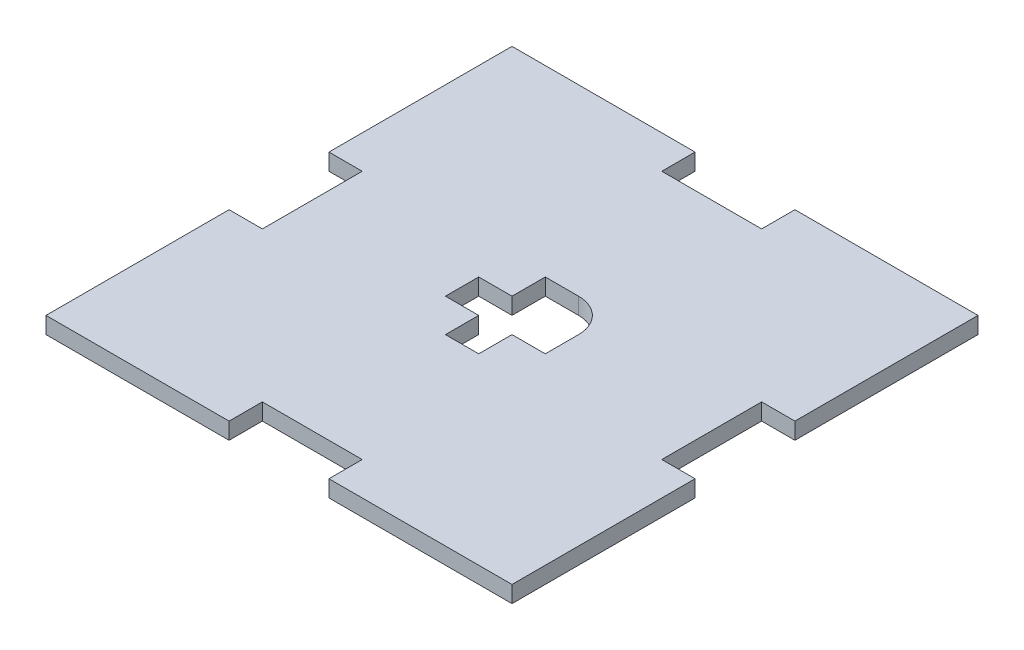
ISO-10303-21;
HEADER;
FILE_DESCRIPTION(('STEP AP214'),'2;1');
FILE_NAME('part.step','',(''),(''),'','','');
FILE_SCHEMA(('AUTOMOTIVE_DESIGN { 1 0 10303 214 1 1 1 1 }'));
ENDSEC;
DATA;
#1=APPLICATION_CONTEXT('core data for automotive mechanical design processes');
#2=APPLICATION_PROTOCOL_DEFINITION('international standard','automotive_design',2000,#1);
#3=PRODUCT_CONTEXT('',#1,'mechanical');
#4=PRODUCT('Part','Part','',(#3));
#5=PRODUCT_RELATED_PRODUCT_CATEGORY('part','',(#4));
#6=PRODUCT_DEFINITION_FORMATION('','',#4);
#7=PRODUCT_DEFINITION_CONTEXT('part definition',#1,'design');
#8=PRODUCT_DEFINITION('design','',#6,#7);
#9=PRODUCT_DEFINITION_SHAPE('','',#8);
#10=(LENGTH_UNIT() NAMED_UNIT(*) SI_UNIT(.MILLI.,.METRE.));
#11=(NAMED_UNIT(*) PLANE_ANGLE_UNIT() SI_UNIT($,.RADIAN.));
#12=(NAMED_UNIT(*) SI_UNIT($,.STERADIAN.) SOLID_ANGLE_UNIT());
#13=UNCERTAINTY_MEASURE_WITH_UNIT(LENGTH_MEASURE(1.E-05),#10,'distance_accuracy_value','');
#14=(GEOMETRIC_REPRESENTATION_CONTEXT(3) GLOBAL_UNCERTAINTY_ASSIGNED_CONTEXT((#13)) GLOBAL_UNIT_ASSIGNED_CONTEXT((#10,
#11,#12)) REPRESENTATION_CONTEXT('',''));
#15=CARTESIAN_POINT('',(0.,0.,0.));
#16=DIRECTION('',(0.,0.,1.));
#17=DIRECTION('',(1.,0.,0.));
#18=AXIS2_PLACEMENT_3D('',#15,#16,#17);
#19=CARTESIAN_POINT('',(0.,3.175,0.));
#20=DIRECTION('',(1.,0.,0.));
#21=DIRECTION('',(0.,0.,-1.));
#22=AXIS2_PLACEMENT_3D('',#19,#20,#21);
#23=PLANE('',#22);
#24=DIRECTION('',(0.,0.,1.));
#25=VECTOR('',#24,1.);
#26=CARTESIAN_POINT('',(0.,0.,0.));
#27=LINE('',#26,#25);
#28=CARTESIAN_POINT('',(0.,0.,-88.9));
#29=VERTEX_POINT('',#28);
#30=CARTESIAN_POINT('',(0.,0.,-53.9749999999999));
#31=VERTEX_POINT('',#30);
#32=EDGE_CURVE('E264',#29,#31,#27,.T.);
#33=ORIENTED_EDGE('',*,*,#32,.T.);
#34=DIRECTION('',(0.,1.,0.));
#35=VECTOR('',#34,1.);
#36=CARTESIAN_POINT('',(0.,0.,-53.9749999999999));
#37=LINE('',#36,#35);
#38=CARTESIAN_POINT('',(0.,3.175,-53.9749999999999));
#39=VERTEX_POINT('',#38);
#40=EDGE_CURVE('E800',#31,#39,#37,.T.);
#41=ORIENTED_EDGE('',*,*,#40,.T.);
#42=DIRECTION('',(0.,0.,1.));
#43=VECTOR('',#42,1.);
#44=CARTESIAN_POINT('',(0.,3.175,0.));
#45=LINE('',#44,#43);
#46=CARTESIAN_POINT('',(0.,3.175,-88.9));
#47=VERTEX_POINT('',#46);
#48=EDGE_CURVE('E361',#47,#39,#45,.T.);
#49=ORIENTED_EDGE('',*,*,#48,.F.);
#50=DIRECTION('',(0.,-1.,0.));
#51=VECTOR('',#50,1.);
#52=CARTESIAN_POINT('',(0.,3.175,-88.9));
#53=LINE('',#52,#51);
#54=EDGE_CURVE('E284',#47,#29,#53,.T.);
#55=ORIENTED_EDGE('',*,*,#54,.T.);
#56=EDGE_LOOP('',(#33,#41,#49,#55));
#57=FACE_BOUND('',#56,.T.);
#58=ADVANCED_FACE('F33',(#57),#23,.F.);
#59=CARTESIAN_POINT('',(0.,3.175,0.));
#60=DIRECTION('',(0.,0.,-1.));
#61=DIRECTION('',(-1.,0.,0.));
#62=AXIS2_PLACEMENT_3D('',#59,#60,#61);
#63=PLANE('',#62);
#64=DIRECTION('',(1.,0.,0.));
#65=VECTOR('',#64,1.);
#66=CARTESIAN_POINT('',(0.,0.,0.));
#67=LINE('',#66,#65);
#68=CARTESIAN_POINT('',(0.,0.,0.));
#69=VERTEX_POINT('',#68);
#70=CARTESIAN_POINT('',(34.9250000000001,0.,0.));
#71=VERTEX_POINT('',#70);
#72=EDGE_CURVE('E262',#69,#71,#67,.T.);
#73=ORIENTED_EDGE('',*,*,#72,.T.);
#74=DIRECTION('',(0.,1.,0.));
#75=VECTOR('',#74,1.);
#76=CARTESIAN_POINT('',(34.9250000000001,0.,0.));
#77=LINE('',#76,#75);
#78=CARTESIAN_POINT('',(34.9250000000001,3.175,0.));
#79=VERTEX_POINT('',#78);
#80=EDGE_CURVE('E774',#71,#79,#77,.T.);
#81=ORIENTED_EDGE('',*,*,#80,.T.);
#82=DIRECTION('',(1.,0.,0.));
#83=VECTOR('',#82,1.);
#84=CARTESIAN_POINT('',(0.,3.175,0.));
#85=LINE('',#84,#83);
#86=CARTESIAN_POINT('',(0.,3.175,0.));
#87=VERTEX_POINT('',#86);
#88=EDGE_CURVE('E365',#87,#79,#85,.T.);
#89=ORIENTED_EDGE('',*,*,#88,.F.);
#90=DIRECTION('',(0.,-1.,0.));
#91=VECTOR('',#90,1.);
#92=CARTESIAN_POINT('',(0.,3.175,0.));
#93=LINE('',#92,#91);
#94=EDGE_CURVE('E293',#87,#69,#93,.T.);
#95=ORIENTED_EDGE('',*,*,#94,.T.);
#96=EDGE_LOOP('',(#73,#81,#89,#95));
#97=FACE_BOUND('',#96,.T.);
#98=ADVANCED_FACE('F432',(#97),#63,.F.);
#99=CARTESIAN_POINT('',(88.9,3.175,0.));
#100=DIRECTION('',(-1.,0.,0.));
#101=DIRECTION('',(0.,0.,1.));
#102=AXIS2_PLACEMENT_3D('',#99,#100,#101);
#103=PLANE('',#102);
#104=DIRECTION('',(0.,0.,-1.));
#105=VECTOR('',#104,1.);
#106=CARTESIAN_POINT('',(88.9,0.,0.));
#107=LINE('',#106,#105);
#108=CARTESIAN_POINT('',(88.9,0.,0.));
#109=VERTEX_POINT('',#108);
#110=CARTESIAN_POINT('',(88.9,0.,-34.925));
#111=VERTEX_POINT('',#110);
#112=EDGE_CURVE('E277',#109,#111,#107,.T.);
#113=ORIENTED_EDGE('',*,*,#112,.T.);
#114=DIRECTION('',(0.,1.,0.));
#115=VECTOR('',#114,1.);
#116=CARTESIAN_POINT('',(88.9,0.,-34.925));
#117=LINE('',#116,#115);
#118=CARTESIAN_POINT('',(88.9,3.175,-34.925));
#119=VERTEX_POINT('',#118);
#120=EDGE_CURVE('E744',#111,#119,#117,.T.);
#121=ORIENTED_EDGE('',*,*,#120,.T.);
#122=DIRECTION('',(0.,0.,-1.));
#123=VECTOR('',#122,1.);
#124=CARTESIAN_POINT('',(88.9,3.175,0.));
#125=LINE('',#124,#123);
#126=CARTESIAN_POINT('',(88.9,3.175,0.));
#127=VERTEX_POINT('',#126);
#128=EDGE_CURVE('E368',#127,#119,#125,.T.);
#129=ORIENTED_EDGE('',*,*,#128,.F.);
#130=DIRECTION('',(0.,-1.,0.));
#131=VECTOR('',#130,1.);
#132=CARTESIAN_POINT('',(88.9,3.175,0.));
#133=LINE('',#132,#131);
#134=EDGE_CURVE('E290',#127,#109,#133,.T.);
#135=ORIENTED_EDGE('',*,*,#134,.T.);
#136=EDGE_LOOP('',(#113,#121,#129,#135));
#137=FACE_BOUND('',#136,.T.);
#138=ADVANCED_FACE('F437',(#137),#103,.F.);
#139=CARTESIAN_POINT('',(0.,3.175,-88.9));
#140=DIRECTION('',(0.,0.,1.));
#141=DIRECTION('',(1.,0.,0.));
#142=AXIS2_PLACEMENT_3D('',#139,#140,#141);
#143=PLANE('',#142);
#144=DIRECTION('',(-1.,0.,0.));
#145=VECTOR('',#144,1.);
#146=CARTESIAN_POINT('',(0.,3.175,-88.9));
#147=LINE('',#146,#145);
#148=CARTESIAN_POINT('',(34.925,3.175,-88.9));
#149=VERTEX_POINT('',#148);
#150=EDGE_CURVE('E370',#149,#47,#147,.T.);
#151=ORIENTED_EDGE('',*,*,#150,.F.);
#152=DIRECTION('',(0.,1.,0.));
#153=VECTOR('',#152,1.);
#154=CARTESIAN_POINT('',(34.925,0.,-88.9));
#155=LINE('',#154,#153);
#156=CARTESIAN_POINT('',(34.925,0.,-88.9));
#157=VERTEX_POINT('',#156);
#158=EDGE_CURVE('E314',#157,#149,#155,.T.);
#159=ORIENTED_EDGE('',*,*,#158,.F.);
#160=DIRECTION('',(-1.,0.,0.));
#161=VECTOR('',#160,1.);
#162=CARTESIAN_POINT('',(0.,0.,-88.9));
#163=LINE('',#162,#161);
#164=EDGE_CURVE('E280',#157,#29,#163,.T.);
#165=ORIENTED_EDGE('',*,*,#164,.T.);
#166=ORIENTED_EDGE('',*,*,#54,.F.);
#167=EDGE_LOOP('',(#151,#159,#165,#166));
#168=FACE_BOUND('',#167,.T.);
#169=ADVANCED_FACE('F442',(#168),#143,.F.);
#170=CARTESIAN_POINT('',(0.,3.175,-34.9249999999999));
#171=VERTEX_POINT('',#170);
#172=EDGE_CURVE('E255',#171,#87,#45,.T.);
#173=ORIENTED_EDGE('',*,*,#172,.F.);
#174=DIRECTION('',(0.,1.,0.));
#175=VECTOR('',#174,1.);
#176=CARTESIAN_POINT('',(0.,0.,-34.9249999999999));
#177=LINE('',#176,#175);
#178=CARTESIAN_POINT('',(0.,0.,-34.9249999999999));
#179=VERTEX_POINT('',#178);
#180=EDGE_CURVE('E240',#179,#171,#177,.T.);
#181=ORIENTED_EDGE('',*,*,#180,.F.);
#182=EDGE_CURVE('E253',#179,#69,#27,.T.);
#183=ORIENTED_EDGE('',*,*,#182,.T.);
#184=ORIENTED_EDGE('',*,*,#94,.F.);
#185=EDGE_LOOP('',(#173,#181,#183,#184));
#186=FACE_BOUND('',#185,.T.);
#187=ADVANCED_FACE('F251',(#186),#23,.F.);
#188=CARTESIAN_POINT('',(53.9750000000001,3.175,0.));
#189=VERTEX_POINT('',#188);
#190=EDGE_CURVE('E364',#189,#127,#85,.T.);
#191=ORIENTED_EDGE('',*,*,#190,.F.);
#192=DIRECTION('',(0.,1.,0.));
#193=VECTOR('',#192,1.);
#194=CARTESIAN_POINT('',(53.9750000000001,0.,0.));
#195=LINE('',#194,#193);
#196=CARTESIAN_POINT('',(53.9750000000001,0.,0.));
#197=VERTEX_POINT('',#196);
#198=EDGE_CURVE('E782',#197,#189,#195,.T.);
#199=ORIENTED_EDGE('',*,*,#198,.F.);
#200=EDGE_CURVE('E268',#197,#109,#67,.T.);
#201=ORIENTED_EDGE('',*,*,#200,.T.);
#202=ORIENTED_EDGE('',*,*,#134,.F.);
#203=EDGE_LOOP('',(#191,#199,#201,#202));
#204=FACE_BOUND('',#203,.T.);
#205=ADVANCED_FACE('F440',(#204),#63,.F.);
#206=CARTESIAN_POINT('',(88.9,3.175,-53.975));
#207=VERTEX_POINT('',#206);
#208=CARTESIAN_POINT('',(88.9,3.175,-88.9));
#209=VERTEX_POINT('',#208);
#210=EDGE_CURVE('E367',#207,#209,#125,.T.);
#211=ORIENTED_EDGE('',*,*,#210,.F.);
#212=DIRECTION('',(0.,1.,0.));
#213=VECTOR('',#212,1.);
#214=CARTESIAN_POINT('',(88.9,0.,-53.975));
#215=LINE('',#214,#213);
#216=CARTESIAN_POINT('',(88.9,0.,-53.975));
#217=VERTEX_POINT('',#216);
#218=EDGE_CURVE('E758',#217,#207,#215,.T.);
#219=ORIENTED_EDGE('',*,*,#218,.F.);
#220=CARTESIAN_POINT('',(88.9,0.,-88.9));
#221=VERTEX_POINT('',#220);
#222=EDGE_CURVE('E276',#217,#221,#107,.T.);
#223=ORIENTED_EDGE('',*,*,#222,.T.);
#224=DIRECTION('',(0.,-1.,0.));
#225=VECTOR('',#224,1.);
#226=CARTESIAN_POINT('',(88.9,3.175,-88.9));
#227=LINE('',#226,#225);
#228=EDGE_CURVE('E287',#209,#221,#227,.T.);
#229=ORIENTED_EDGE('',*,*,#228,.F.);
#230=EDGE_LOOP('',(#211,#219,#223,#229));
#231=FACE_BOUND('',#230,.T.);
#232=ADVANCED_FACE('F384',(#231),#103,.F.);
#233=CARTESIAN_POINT('',(53.975,0.,-88.9));
#234=VERTEX_POINT('',#233);
#235=EDGE_CURVE('E281',#221,#234,#163,.T.);
#236=ORIENTED_EDGE('',*,*,#235,.T.);
#237=DIRECTION('',(0.,1.,0.));
#238=VECTOR('',#237,1.);
#239=CARTESIAN_POINT('',(53.975,0.,-88.9));
#240=LINE('',#239,#238);
#241=CARTESIAN_POINT('',(53.975,3.175,-88.9));
#242=VERTEX_POINT('',#241);
#243=EDGE_CURVE('E318',#234,#242,#240,.T.);
#244=ORIENTED_EDGE('',*,*,#243,.T.);
#245=EDGE_CURVE('E273',#209,#242,#147,.T.);
#246=ORIENTED_EDGE('',*,*,#245,.F.);
#247=ORIENTED_EDGE('',*,*,#228,.T.);
#248=EDGE_LOOP('',(#236,#244,#246,#247));
#249=FACE_BOUND('',#248,.T.);
#250=ADVANCED_FACE('F389',(#249),#143,.F.);
#251=CARTESIAN_POINT('',(0.,3.175,0.));
#252=DIRECTION('',(0.,-1.,0.));
#253=DIRECTION('',(0.,0.,-1.));
#254=AXIS2_PLACEMENT_3D('',#251,#252,#253);
#255=PLANE('',#254);
#256=DIRECTION('',(-1.,0.,0.));
#257=VECTOR('',#256,1.);
#258=CARTESIAN_POINT('',(47.625,3.175,-53.975));
#259=LINE('',#258,#257);
#260=CARTESIAN_POINT('',(47.625,3.175,-53.975));
#261=VERTEX_POINT('',#260);
#262=CARTESIAN_POINT('',(41.275,3.175,-53.975));
#263=VERTEX_POINT('',#262);
#264=EDGE_CURVE('E303',#261,#263,#259,.T.);
#265=ORIENTED_EDGE('',*,*,#264,.F.);
#266=CARTESIAN_POINT('',(47.625,3.175,-47.625));
#267=DIRECTION('',(0.,-1.,0.));
#268=DIRECTION('',(0.,0.,-1.));
#269=AXIS2_PLACEMENT_3D('',#266,#267,#268);
#270=CIRCLE('',#269,6.35);
#271=CARTESIAN_POINT('',(53.975,3.175,-47.625));
#272=VERTEX_POINT('',#271);
#273=EDGE_CURVE('E41',#261,#272,#270,.T.);
#274=ORIENTED_EDGE('',*,*,#273,.T.);
#275=DIRECTION('',(0.,0.,-1.));
#276=VECTOR('',#275,1.);
#277=CARTESIAN_POINT('',(53.975,3.175,-41.275));
#278=LINE('',#277,#276);
#279=CARTESIAN_POINT('',(53.975,3.175,-41.275));
#280=VERTEX_POINT('',#279);
#281=EDGE_CURVE('E344',#280,#272,#278,.T.);
#282=ORIENTED_EDGE('',*,*,#281,.F.);
#283=DIRECTION('',(1.,0.,0.));
#284=VECTOR('',#283,1.);
#285=CARTESIAN_POINT('',(47.625,3.175,-41.275));
#286=LINE('',#285,#284);
#287=CARTESIAN_POINT('',(47.625,3.175,-41.275));
#288=VERTEX_POINT('',#287);
#289=EDGE_CURVE('E341',#288,#280,#286,.T.);
#290=ORIENTED_EDGE('',*,*,#289,.F.);
#291=DIRECTION('',(0.,0.,-1.));
#292=VECTOR('',#291,1.);
#293=CARTESIAN_POINT('',(47.625,3.175,-34.925));
#294=LINE('',#293,#292);
#295=CARTESIAN_POINT('',(47.625,3.175,-34.925));
#296=VERTEX_POINT('',#295);
#297=EDGE_CURVE('E338',#296,#288,#294,.T.);
#298=ORIENTED_EDGE('',*,*,#297,.F.);
#299=DIRECTION('',(1.,0.,0.));
#300=VECTOR('',#299,1.);
#301=CARTESIAN_POINT('',(47.625,3.175,-34.925));
#302=LINE('',#301,#300);
#303=CARTESIAN_POINT('',(41.275,3.175,-34.925));
#304=VERTEX_POINT('',#303);
#305=EDGE_CURVE('E335',#304,#296,#302,.T.);
#306=ORIENTED_EDGE('',*,*,#305,.F.);
#307=DIRECTION('',(0.,0.,1.));
#308=VECTOR('',#307,1.);
#309=CARTESIAN_POINT('',(41.275,3.175,-34.925));
#310=LINE('',#309,#308);
#311=CARTESIAN_POINT('',(41.275,3.175,-41.275));
#312=VERTEX_POINT('',#311);
#313=EDGE_CURVE('E332',#312,#304,#310,.T.);
#314=ORIENTED_EDGE('',*,*,#313,.F.);
#315=DIRECTION('',(1.,0.,0.));
#316=VECTOR('',#315,1.);
#317=CARTESIAN_POINT('',(34.925,3.175,-41.275));
#318=LINE('',#317,#316);
#319=CARTESIAN_POINT('',(34.925,3.175,-41.275));
#320=VERTEX_POINT('',#319);
#321=EDGE_CURVE('E329',#320,#312,#318,.T.);
#322=ORIENTED_EDGE('',*,*,#321,.F.);
#323=DIRECTION('',(0.,0.,1.));
#324=VECTOR('',#323,1.);
#325=CARTESIAN_POINT('',(34.925,3.175,-41.275));
#326=LINE('',#325,#324);
#327=CARTESIAN_POINT('',(34.925,3.175,-47.625));
#328=VERTEX_POINT('',#327);
#329=EDGE_CURVE('E326',#328,#320,#326,.T.);
#330=ORIENTED_EDGE('',*,*,#329,.F.);
#331=DIRECTION('',(-1.,0.,0.));
#332=VECTOR('',#331,1.);
#333=CARTESIAN_POINT('',(34.925,3.175,-47.625));
#334=LINE('',#333,#332);
#335=CARTESIAN_POINT('',(41.275,3.175,-47.625));
#336=VERTEX_POINT('',#335);
#337=EDGE_CURVE('E316',#336,#328,#334,.T.);
#338=ORIENTED_EDGE('',*,*,#337,.F.);
#339=DIRECTION('',(0.,0.,1.));
#340=VECTOR('',#339,1.);
#341=CARTESIAN_POINT('',(41.275,3.175,-47.625));
#342=LINE('',#341,#340);
#343=EDGE_CURVE('E313',#263,#336,#342,.T.);
#344=ORIENTED_EDGE('',*,*,#343,.F.);
#345=EDGE_LOOP('',(#265,#274,#282,#290,#298,#306,#314,#322,#330,#338,#344));
#346=FACE_BOUND('',#345,.T.);
#347=ORIENTED_EDGE('',*,*,#48,.T.);
#348=DIRECTION('',(-1.,0.,0.));
#349=VECTOR('',#348,1.);
#350=CARTESIAN_POINT('',(0.,3.175,-53.9749999999999));
#351=LINE('',#350,#349);
#352=CARTESIAN_POINT('',(6.35000000000001,3.175,-53.9749999999999));
#353=VERTEX_POINT('',#352);
#354=EDGE_CURVE('E247',#353,#39,#351,.T.);
#355=ORIENTED_EDGE('',*,*,#354,.F.);
#356=DIRECTION('',(0.,0.,-1.));
#357=VECTOR('',#356,1.);
#358=CARTESIAN_POINT('',(6.35000000000004,3.175,-34.9249999999999));
#359=LINE('',#358,#357);
#360=CARTESIAN_POINT('',(6.35000000000004,3.175,-34.9249999999999));
#361=VERTEX_POINT('',#360);
#362=EDGE_CURVE('E813',#361,#353,#359,.T.);
#363=ORIENTED_EDGE('',*,*,#362,.F.);
#364=DIRECTION('',(1.,0.,0.));
#365=VECTOR('',#364,1.);
#366=CARTESIAN_POINT('',(0.,3.175,-34.9249999999999));
#367=LINE('',#366,#365);
#368=EDGE_CURVE('E816',#171,#361,#367,.T.);
#369=ORIENTED_EDGE('',*,*,#368,.F.);
#370=ORIENTED_EDGE('',*,*,#172,.T.);
#371=ORIENTED_EDGE('',*,*,#88,.T.);
#372=DIRECTION('',(0.,0.,1.));
#373=VECTOR('',#372,1.);
#374=CARTESIAN_POINT('',(34.9250000000001,3.175,0.));
#375=LINE('',#374,#373);
#376=CARTESIAN_POINT('',(34.9250000000001,3.175,-6.34999999999999));
#377=VERTEX_POINT('',#376);
#378=EDGE_CURVE('E791',#377,#79,#375,.T.);
#379=ORIENTED_EDGE('',*,*,#378,.F.);
#380=DIRECTION('',(-1.,0.,0.));
#381=VECTOR('',#380,1.);
#382=CARTESIAN_POINT('',(53.9750000000001,3.175,-6.35000000000001));
#383=LINE('',#382,#381);
#384=CARTESIAN_POINT('',(53.9750000000001,3.175,-6.35000000000001));
#385=VERTEX_POINT('',#384);
#386=EDGE_CURVE('E794',#385,#377,#383,.T.);
#387=ORIENTED_EDGE('',*,*,#386,.F.);
#388=DIRECTION('',(0.,0.,-1.));
#389=VECTOR('',#388,1.);
#390=CARTESIAN_POINT('',(53.9750000000001,3.175,0.));
#391=LINE('',#390,#389);
#392=EDGE_CURVE('E797',#189,#385,#391,.T.);
#393=ORIENTED_EDGE('',*,*,#392,.F.);
#394=ORIENTED_EDGE('',*,*,#190,.T.);
#395=ORIENTED_EDGE('',*,*,#128,.T.);
#396=DIRECTION('',(1.,0.,0.));
#397=VECTOR('',#396,1.);
#398=CARTESIAN_POINT('',(88.9,3.175,-34.925));
#399=LINE('',#398,#397);
#400=CARTESIAN_POINT('',(82.55,3.175,-34.925));
#401=VERTEX_POINT('',#400);
#402=EDGE_CURVE('E767',#401,#119,#399,.T.);
#403=ORIENTED_EDGE('',*,*,#402,.F.);
#404=DIRECTION('',(0.,0.,1.));
#405=VECTOR('',#404,1.);
#406=CARTESIAN_POINT('',(82.55,3.175,-53.975));
#407=LINE('',#406,#405);
#408=CARTESIAN_POINT('',(82.55,3.175,-53.975));
#409=VERTEX_POINT('',#408);
#410=EDGE_CURVE('E770',#409,#401,#407,.T.);
#411=ORIENTED_EDGE('',*,*,#410,.F.);
#412=DIRECTION('',(-1.,0.,0.));
#413=VECTOR('',#412,1.);
#414=CARTESIAN_POINT('',(88.9,3.175,-53.975));
#415=LINE('',#414,#413);
#416=EDGE_CURVE('E381',#207,#409,#415,.T.);
#417=ORIENTED_EDGE('',*,*,#416,.F.);
#418=ORIENTED_EDGE('',*,*,#210,.T.);
#419=ORIENTED_EDGE('',*,*,#245,.T.);
#420=DIRECTION('',(0.,0.,-1.));
#421=VECTOR('',#420,1.);
#422=CARTESIAN_POINT('',(53.975,3.175,-88.9));
#423=LINE('',#422,#421);
#424=CARTESIAN_POINT('',(53.975,3.175,-82.55));
#425=VERTEX_POINT('',#424);
#426=EDGE_CURVE('E747',#425,#242,#423,.T.);
#427=ORIENTED_EDGE('',*,*,#426,.F.);
#428=DIRECTION('',(1.,0.,0.));
#429=VECTOR('',#428,1.);
#430=CARTESIAN_POINT('',(34.925,3.175,-82.55));
#431=LINE('',#430,#429);
#432=CARTESIAN_POINT('',(34.925,3.175,-82.55));
#433=VERTEX_POINT('',#432);
#434=EDGE_CURVE('E743',#433,#425,#431,.T.);
#435=ORIENTED_EDGE('',*,*,#434,.F.);
#436=DIRECTION('',(0.,0.,1.));
#437=VECTOR('',#436,1.);
#438=CARTESIAN_POINT('',(34.925,3.175,-88.9));
#439=LINE('',#438,#437);
#440=EDGE_CURVE('E739',#149,#433,#439,.T.);
#441=ORIENTED_EDGE('',*,*,#440,.F.);
#442=ORIENTED_EDGE('',*,*,#150,.T.);
#443=EDGE_LOOP('',(#347,#355,#363,#369,#370,#371,#379,#387,#393,#394,#395,#403,#411,#417,#418,
#419,#427,#435,#441,#442));
#444=FACE_BOUND('',#443,.T.);
#445=ADVANCED_FACE('F309',(#346,#444),#255,.F.);
#446=CARTESIAN_POINT('',(0.,0.,0.));
#447=DIRECTION('',(0.,-1.,0.));
#448=DIRECTION('',(0.,0.,-1.));
#449=AXIS2_PLACEMENT_3D('',#446,#447,#448);
#450=PLANE('',#449);
#451=DIRECTION('',(0.,0.,-1.));
#452=VECTOR('',#451,1.);
#453=CARTESIAN_POINT('',(53.975,0.,-41.275));
#454=LINE('',#453,#452);
#455=CARTESIAN_POINT('',(53.975,0.,-41.275));
#456=VERTEX_POINT('',#455);
#457=CARTESIAN_POINT('',(53.975,0.,-47.625));
#458=VERTEX_POINT('',#457);
#459=EDGE_CURVE('E321',#456,#458,#454,.T.);
#460=ORIENTED_EDGE('',*,*,#459,.T.);
#461=CARTESIAN_POINT('',(47.625,0.,-47.625));
#462=DIRECTION('',(0.,-1.,0.));
#463=DIRECTION('',(0.,0.,-1.));
#464=AXIS2_PLACEMENT_3D('',#461,#462,#463);
#465=CIRCLE('',#464,6.35);
#466=CARTESIAN_POINT('',(47.625,0.,-53.975));
#467=VERTEX_POINT('',#466);
#468=EDGE_CURVE('E11',#458,#467,#465,.F.);
#469=ORIENTED_EDGE('',*,*,#468,.T.);
#470=DIRECTION('',(-1.,0.,0.));
#471=VECTOR('',#470,1.);
#472=CARTESIAN_POINT('',(47.625,0.,-53.975));
#473=LINE('',#472,#471);
#474=CARTESIAN_POINT('',(41.275,0.,-53.975));
#475=VERTEX_POINT('',#474);
#476=EDGE_CURVE('E305',#467,#475,#473,.T.);
#477=ORIENTED_EDGE('',*,*,#476,.T.);
#478=DIRECTION('',(0.,0.,1.));
#479=VECTOR('',#478,1.);
#480=CARTESIAN_POINT('',(41.275,0.,-47.625));
#481=LINE('',#480,#479);
#482=CARTESIAN_POINT('',(41.275,0.,-47.625));
#483=VERTEX_POINT('',#482);
#484=EDGE_CURVE('E401',#475,#483,#481,.T.);
#485=ORIENTED_EDGE('',*,*,#484,.T.);
#486=DIRECTION('',(-1.,0.,0.));
#487=VECTOR('',#486,1.);
#488=CARTESIAN_POINT('',(34.925,0.,-47.625));
#489=LINE('',#488,#487);
#490=CARTESIAN_POINT('',(34.925,0.,-47.625));
#491=VERTEX_POINT('',#490);
#492=EDGE_CURVE('E404',#483,#491,#489,.T.);
#493=ORIENTED_EDGE('',*,*,#492,.T.);
#494=DIRECTION('',(0.,0.,1.));
#495=VECTOR('',#494,1.);
#496=CARTESIAN_POINT('',(34.925,0.,-41.275));
#497=LINE('',#496,#495);
#498=CARTESIAN_POINT('',(34.925,0.,-41.275));
#499=VERTEX_POINT('',#498);
#500=EDGE_CURVE('E407',#491,#499,#497,.T.);
#501=ORIENTED_EDGE('',*,*,#500,.T.);
#502=DIRECTION('',(1.,0.,0.));
#503=VECTOR('',#502,1.);
#504=CARTESIAN_POINT('',(34.925,0.,-41.275));
#505=LINE('',#504,#503);
#506=CARTESIAN_POINT('',(41.275,0.,-41.275));
#507=VERTEX_POINT('',#506);
#508=EDGE_CURVE('E410',#499,#507,#505,.T.);
#509=ORIENTED_EDGE('',*,*,#508,.T.);
#510=DIRECTION('',(0.,0.,1.));
#511=VECTOR('',#510,1.);
#512=CARTESIAN_POINT('',(41.275,0.,-34.925));
#513=LINE('',#512,#511);
#514=CARTESIAN_POINT('',(41.275,0.,-34.925));
#515=VERTEX_POINT('',#514);
#516=EDGE_CURVE('E413',#507,#515,#513,.T.);
#517=ORIENTED_EDGE('',*,*,#516,.T.);
#518=DIRECTION('',(1.,0.,0.));
#519=VECTOR('',#518,1.);
#520=CARTESIAN_POINT('',(47.625,0.,-34.925));
#521=LINE('',#520,#519);
#522=CARTESIAN_POINT('',(47.625,0.,-34.925));
#523=VERTEX_POINT('',#522);
#524=EDGE_CURVE('E416',#515,#523,#521,.T.);
#525=ORIENTED_EDGE('',*,*,#524,.T.);
#526=DIRECTION('',(0.,0.,-1.));
#527=VECTOR('',#526,1.);
#528=CARTESIAN_POINT('',(47.625,0.,-34.925));
#529=LINE('',#528,#527);
#530=CARTESIAN_POINT('',(47.625,0.,-41.275));
#531=VERTEX_POINT('',#530);
#532=EDGE_CURVE('E419',#523,#531,#529,.T.);
#533=ORIENTED_EDGE('',*,*,#532,.T.);
#534=DIRECTION('',(1.,0.,0.));
#535=VECTOR('',#534,1.);
#536=CARTESIAN_POINT('',(47.625,0.,-41.275));
#537=LINE('',#536,#535);
#538=EDGE_CURVE('E421',#531,#456,#537,.T.);
#539=ORIENTED_EDGE('',*,*,#538,.T.);
#540=EDGE_LOOP('',(#460,#469,#477,#485,#493,#501,#509,#517,#525,#533,#539));
#541=FACE_BOUND('',#540,.T.);
#542=DIRECTION('',(-1.,0.,0.));
#543=VECTOR('',#542,1.);
#544=CARTESIAN_POINT('',(0.,0.,-53.9749999999999));
#545=LINE('',#544,#543);
#546=CARTESIAN_POINT('',(6.35000000000001,0.,-53.9749999999999));
#547=VERTEX_POINT('',#546);
#548=EDGE_CURVE('E256',#547,#31,#545,.T.);
#549=ORIENTED_EDGE('',*,*,#548,.T.);
#550=ORIENTED_EDGE('',*,*,#32,.F.);
#551=ORIENTED_EDGE('',*,*,#164,.F.);
#552=DIRECTION('',(0.,0.,1.));
#553=VECTOR('',#552,1.);
#554=CARTESIAN_POINT('',(34.925,0.,-88.9));
#555=LINE('',#554,#553);
#556=CARTESIAN_POINT('',(34.925,0.,-82.55));
#557=VERTEX_POINT('',#556);
#558=EDGE_CURVE('E750',#157,#557,#555,.T.);
#559=ORIENTED_EDGE('',*,*,#558,.T.);
#560=DIRECTION('',(1.,0.,0.));
#561=VECTOR('',#560,1.);
#562=CARTESIAN_POINT('',(34.925,0.,-82.55));
#563=LINE('',#562,#561);
#564=CARTESIAN_POINT('',(53.975,0.,-82.55));
#565=VERTEX_POINT('',#564);
#566=EDGE_CURVE('E753',#557,#565,#563,.T.);
#567=ORIENTED_EDGE('',*,*,#566,.T.);
#568=DIRECTION('',(0.,0.,-1.));
#569=VECTOR('',#568,1.);
#570=CARTESIAN_POINT('',(53.975,0.,-88.9));
#571=LINE('',#570,#569);
#572=EDGE_CURVE('E399',#565,#234,#571,.T.);
#573=ORIENTED_EDGE('',*,*,#572,.T.);
#574=ORIENTED_EDGE('',*,*,#235,.F.);
#575=ORIENTED_EDGE('',*,*,#222,.F.);
#576=DIRECTION('',(-1.,0.,0.));
#577=VECTOR('',#576,1.);
#578=CARTESIAN_POINT('',(88.9,0.,-53.975));
#579=LINE('',#578,#577);
#580=CARTESIAN_POINT('',(82.55,0.,-53.975));
#581=VERTEX_POINT('',#580);
#582=EDGE_CURVE('E769',#217,#581,#579,.T.);
#583=ORIENTED_EDGE('',*,*,#582,.T.);
#584=DIRECTION('',(0.,0.,1.));
#585=VECTOR('',#584,1.);
#586=CARTESIAN_POINT('',(82.55,0.,-53.975));
#587=LINE('',#586,#585);
#588=CARTESIAN_POINT('',(82.55,0.,-34.925));
#589=VERTEX_POINT('',#588);
#590=EDGE_CURVE('E777',#581,#589,#587,.T.);
#591=ORIENTED_EDGE('',*,*,#590,.T.);
#592=DIRECTION('',(1.,0.,0.));
#593=VECTOR('',#592,1.);
#594=CARTESIAN_POINT('',(88.9,0.,-34.925));
#595=LINE('',#594,#593);
#596=EDGE_CURVE('E761',#589,#111,#595,.T.);
#597=ORIENTED_EDGE('',*,*,#596,.T.);
#598=ORIENTED_EDGE('',*,*,#112,.F.);
#599=ORIENTED_EDGE('',*,*,#200,.F.);
#600=DIRECTION('',(0.,0.,-1.));
#601=VECTOR('',#600,1.);
#602=CARTESIAN_POINT('',(53.9750000000001,0.,0.));
#603=LINE('',#602,#601);
#604=CARTESIAN_POINT('',(53.9750000000001,0.,-6.35000000000001));
#605=VERTEX_POINT('',#604);
#606=EDGE_CURVE('E793',#197,#605,#603,.T.);
#607=ORIENTED_EDGE('',*,*,#606,.T.);
#608=DIRECTION('',(-1.,0.,0.));
#609=VECTOR('',#608,1.);
#610=CARTESIAN_POINT('',(53.9750000000001,0.,-6.35000000000001));
#611=LINE('',#610,#609);
#612=CARTESIAN_POINT('',(34.9250000000001,0.,-6.34999999999999));
#613=VERTEX_POINT('',#612);
#614=EDGE_CURVE('E802',#605,#613,#611,.T.);
#615=ORIENTED_EDGE('',*,*,#614,.T.);
#616=DIRECTION('',(0.,0.,1.));
#617=VECTOR('',#616,1.);
#618=CARTESIAN_POINT('',(34.9250000000001,0.,0.));
#619=LINE('',#618,#617);
#620=EDGE_CURVE('E785',#613,#71,#619,.T.);
#621=ORIENTED_EDGE('',*,*,#620,.T.);
#622=ORIENTED_EDGE('',*,*,#72,.F.);
#623=ORIENTED_EDGE('',*,*,#182,.F.);
#624=DIRECTION('',(1.,0.,0.));
#625=VECTOR('',#624,1.);
#626=CARTESIAN_POINT('',(0.,0.,-34.9249999999999));
#627=LINE('',#626,#625);
#628=CARTESIAN_POINT('',(6.35000000000004,0.,-34.9249999999999));
#629=VERTEX_POINT('',#628);
#630=EDGE_CURVE('E236',#179,#629,#627,.T.);
#631=ORIENTED_EDGE('',*,*,#630,.T.);
#632=DIRECTION('',(0.,0.,-1.));
#633=VECTOR('',#632,1.);
#634=CARTESIAN_POINT('',(6.35000000000004,0.,-34.9249999999999));
#635=LINE('',#634,#633);
#636=EDGE_CURVE('E246',#629,#547,#635,.T.);
#637=ORIENTED_EDGE('',*,*,#636,.T.);
#638=EDGE_LOOP('',(#549,#550,#551,#559,#567,#573,#574,#575,#583,#591,#597,#598,#599,#607,#615,
#621,#622,#623,#631,#637));
#639=FACE_BOUND('',#638,.T.);
#640=ADVANCED_FACE('F259',(#541,#639),#450,.T.);
#641=CARTESIAN_POINT('',(53.975,0.,-41.275));
#642=DIRECTION('',(1.,0.,0.));
#643=DIRECTION('',(0.,0.,-1.));
#644=AXIS2_PLACEMENT_3D('',#641,#642,#643);
#645=PLANE('',#644);
#646=ORIENTED_EDGE('',*,*,#281,.T.);
#647=DIRECTION('',(0.,1.,0.));
#648=VECTOR('',#647,1.);
#649=CARTESIAN_POINT('',(53.975,0.,-47.625));
#650=LINE('',#649,#648);
#651=EDGE_CURVE('E48',#272,#458,#650,.F.);
#652=ORIENTED_EDGE('',*,*,#651,.T.);
#653=ORIENTED_EDGE('',*,*,#459,.F.);
#654=DIRECTION('',(0.,1.,0.));
#655=VECTOR('',#654,1.);
#656=CARTESIAN_POINT('',(53.975,0.,-41.275));
#657=LINE('',#656,#655);
#658=EDGE_CURVE('E265',#456,#280,#657,.T.);
#659=ORIENTED_EDGE('',*,*,#658,.T.);
#660=EDGE_LOOP('',(#646,#652,#653,#659));
#661=FACE_BOUND('',#660,.T.);
#662=ADVANCED_FACE('F575',(#661),#645,.F.);
#663=CARTESIAN_POINT('',(47.625,0.,-41.275));
#664=DIRECTION('',(0.,0.,1.));
#665=DIRECTION('',(1.,0.,0.));
#666=AXIS2_PLACEMENT_3D('',#663,#664,#665);
#667=PLANE('',#666);
#668=ORIENTED_EDGE('',*,*,#289,.T.);
#669=ORIENTED_EDGE('',*,*,#658,.F.);
#670=ORIENTED_EDGE('',*,*,#538,.F.);
#671=DIRECTION('',(0.,1.,0.));
#672=VECTOR('',#671,1.);
#673=CARTESIAN_POINT('',(47.625,0.,-41.275));
#674=LINE('',#673,#672);
#675=EDGE_CURVE('E269',#531,#288,#674,.T.);
#676=ORIENTED_EDGE('',*,*,#675,.T.);
#677=EDGE_LOOP('',(#668,#669,#670,#676));
#678=FACE_BOUND('',#677,.T.);
#679=ADVANCED_FACE('F566',(#678),#667,.F.);
#680=CARTESIAN_POINT('',(47.625,0.,-34.925));
#681=DIRECTION('',(1.,0.,0.));
#682=DIRECTION('',(0.,0.,-1.));
#683=AXIS2_PLACEMENT_3D('',#680,#681,#682);
#684=PLANE('',#683);
#685=ORIENTED_EDGE('',*,*,#297,.T.);
#686=ORIENTED_EDGE('',*,*,#675,.F.);
#687=ORIENTED_EDGE('',*,*,#532,.F.);
#688=DIRECTION('',(0.,1.,0.));
#689=VECTOR('',#688,1.);
#690=CARTESIAN_POINT('',(47.625,0.,-34.925));
#691=LINE('',#690,#689);
#692=EDGE_CURVE('E347',#523,#296,#691,.T.);
#693=ORIENTED_EDGE('',*,*,#692,.T.);
#694=EDGE_LOOP('',(#685,#686,#687,#693));
#695=FACE_BOUND('',#694,.T.);
#696=ADVANCED_FACE('F556',(#695),#684,.F.);
#697=CARTESIAN_POINT('',(47.625,0.,-34.925));
#698=DIRECTION('',(0.,0.,1.));
#699=DIRECTION('',(1.,0.,0.));
#700=AXIS2_PLACEMENT_3D('',#697,#698,#699);
#701=PLANE('',#700);
#702=ORIENTED_EDGE('',*,*,#305,.T.);
#703=ORIENTED_EDGE('',*,*,#692,.F.);
#704=ORIENTED_EDGE('',*,*,#524,.F.);
#705=DIRECTION('',(0.,1.,0.));
#706=VECTOR('',#705,1.);
#707=CARTESIAN_POINT('',(41.275,0.,-34.925));
#708=LINE('',#707,#706);
#709=EDGE_CURVE('E349',#515,#304,#708,.T.);
#710=ORIENTED_EDGE('',*,*,#709,.T.);
#711=EDGE_LOOP('',(#702,#703,#704,#710));
#712=FACE_BOUND('',#711,.T.);
#713=ADVANCED_FACE('F546',(#712),#701,.F.);
#714=CARTESIAN_POINT('',(41.275,0.,-34.925));
#715=DIRECTION('',(-1.,0.,0.));
#716=DIRECTION('',(0.,0.,1.));
#717=AXIS2_PLACEMENT_3D('',#714,#715,#716);
#718=PLANE('',#717);
#719=ORIENTED_EDGE('',*,*,#313,.T.);
#720=ORIENTED_EDGE('',*,*,#709,.F.);
#721=ORIENTED_EDGE('',*,*,#516,.F.);
#722=DIRECTION('',(0.,1.,0.));
#723=VECTOR('',#722,1.);
#724=CARTESIAN_POINT('',(41.275,0.,-41.275));
#725=LINE('',#724,#723);
#726=EDGE_CURVE('E351',#507,#312,#725,.T.);
#727=ORIENTED_EDGE('',*,*,#726,.T.);
#728=EDGE_LOOP('',(#719,#720,#721,#727));
#729=FACE_BOUND('',#728,.T.);
#730=ADVANCED_FACE('F536',(#729),#718,.F.);
#731=CARTESIAN_POINT('',(34.925,0.,-41.275));
#732=DIRECTION('',(0.,0.,1.));
#733=DIRECTION('',(1.,0.,0.));
#734=AXIS2_PLACEMENT_3D('',#731,#732,#733);
#735=PLANE('',#734);
#736=ORIENTED_EDGE('',*,*,#321,.T.);
#737=ORIENTED_EDGE('',*,*,#726,.F.);
#738=ORIENTED_EDGE('',*,*,#508,.F.);
#739=DIRECTION('',(0.,1.,0.));
#740=VECTOR('',#739,1.);
#741=CARTESIAN_POINT('',(34.925,0.,-41.275));
#742=LINE('',#741,#740);
#743=EDGE_CURVE('E353',#499,#320,#742,.T.);
#744=ORIENTED_EDGE('',*,*,#743,.T.);
#745=EDGE_LOOP('',(#736,#737,#738,#744));
#746=FACE_BOUND('',#745,.T.);
#747=ADVANCED_FACE('F526',(#746),#735,.F.);
#748=CARTESIAN_POINT('',(34.925,0.,-41.275));
#749=DIRECTION('',(-1.,0.,0.));
#750=DIRECTION('',(0.,0.,1.));
#751=AXIS2_PLACEMENT_3D('',#748,#749,#750);
#752=PLANE('',#751);
#753=ORIENTED_EDGE('',*,*,#329,.T.);
#754=ORIENTED_EDGE('',*,*,#743,.F.);
#755=ORIENTED_EDGE('',*,*,#500,.F.);
#756=DIRECTION('',(0.,1.,0.));
#757=VECTOR('',#756,1.);
#758=CARTESIAN_POINT('',(34.925,0.,-47.625));
#759=LINE('',#758,#757);
#760=EDGE_CURVE('E355',#491,#328,#759,.T.);
#761=ORIENTED_EDGE('',*,*,#760,.T.);
#762=EDGE_LOOP('',(#753,#754,#755,#761));
#763=FACE_BOUND('',#762,.T.);
#764=ADVANCED_FACE('F516',(#763),#752,.F.);
#765=CARTESIAN_POINT('',(34.925,0.,-47.625));
#766=DIRECTION('',(0.,0.,-1.));
#767=DIRECTION('',(-1.,0.,0.));
#768=AXIS2_PLACEMENT_3D('',#765,#766,#767);
#769=PLANE('',#768);
#770=ORIENTED_EDGE('',*,*,#337,.T.);
#771=ORIENTED_EDGE('',*,*,#760,.F.);
#772=ORIENTED_EDGE('',*,*,#492,.F.);
#773=DIRECTION('',(0.,1.,0.));
#774=VECTOR('',#773,1.);
#775=CARTESIAN_POINT('',(41.275,0.,-47.625));
#776=LINE('',#775,#774);
#777=EDGE_CURVE('E357',#483,#336,#776,.T.);
#778=ORIENTED_EDGE('',*,*,#777,.T.);
#779=EDGE_LOOP('',(#770,#771,#772,#778));
#780=FACE_BOUND('',#779,.T.);
#781=ADVANCED_FACE('F505',(#780),#769,.F.);
#782=CARTESIAN_POINT('',(41.275,0.,-47.625));
#783=DIRECTION('',(-1.,0.,0.));
#784=DIRECTION('',(0.,0.,1.));
#785=AXIS2_PLACEMENT_3D('',#782,#783,#784);
#786=PLANE('',#785);
#787=ORIENTED_EDGE('',*,*,#343,.T.);
#788=ORIENTED_EDGE('',*,*,#777,.F.);
#789=ORIENTED_EDGE('',*,*,#484,.F.);
#790=DIRECTION('',(0.,1.,0.));
#791=VECTOR('',#790,1.);
#792=CARTESIAN_POINT('',(41.275,0.,-53.975));
#793=LINE('',#792,#791);
#794=EDGE_CURVE('E359',#475,#263,#793,.T.);
#795=ORIENTED_EDGE('',*,*,#794,.T.);
#796=EDGE_LOOP('',(#787,#788,#789,#795));
#797=FACE_BOUND('',#796,.T.);
#798=ADVANCED_FACE('F500',(#797),#786,.F.);
#799=CARTESIAN_POINT('',(47.625,0.,-53.975));
#800=DIRECTION('',(0.,0.,-1.));
#801=DIRECTION('',(-1.,0.,0.));
#802=AXIS2_PLACEMENT_3D('',#799,#800,#801);
#803=PLANE('',#802);
#804=ORIENTED_EDGE('',*,*,#476,.F.);
#805=DIRECTION('',(0.,1.,0.));
#806=VECTOR('',#805,1.);
#807=CARTESIAN_POINT('',(47.625,3.175,-53.975));
#808=LINE('',#807,#806);
#809=EDGE_CURVE('E295',#467,#261,#808,.T.);
#810=ORIENTED_EDGE('',*,*,#809,.T.);
#811=ORIENTED_EDGE('',*,*,#264,.T.);
#812=ORIENTED_EDGE('',*,*,#794,.F.);
#813=EDGE_LOOP('',(#804,#810,#811,#812));
#814=FACE_BOUND('',#813,.T.);
#815=ADVANCED_FACE('F301',(#814),#803,.F.);
#816=CARTESIAN_POINT('',(34.925,0.,-88.9));
#817=DIRECTION('',(-1.,0.,0.));
#818=DIRECTION('',(0.,0.,1.));
#819=AXIS2_PLACEMENT_3D('',#816,#817,#818);
#820=PLANE('',#819);
#821=ORIENTED_EDGE('',*,*,#440,.T.);
#822=DIRECTION('',(0.,1.,0.));
#823=VECTOR('',#822,1.);
#824=CARTESIAN_POINT('',(34.925,0.,-82.55));
#825=LINE('',#824,#823);
#826=EDGE_CURVE('E394',#557,#433,#825,.T.);
#827=ORIENTED_EDGE('',*,*,#826,.F.);
#828=ORIENTED_EDGE('',*,*,#558,.F.);
#829=ORIENTED_EDGE('',*,*,#158,.T.);
#830=EDGE_LOOP('',(#821,#827,#828,#829));
#831=FACE_BOUND('',#830,.T.);
#832=ADVANCED_FACE('F702',(#831),#820,.F.);
#833=CARTESIAN_POINT('',(53.975,0.,-88.9));
#834=DIRECTION('',(1.,0.,0.));
#835=DIRECTION('',(0.,0.,-1.));
#836=AXIS2_PLACEMENT_3D('',#833,#834,#835);
#837=PLANE('',#836);
#838=ORIENTED_EDGE('',*,*,#426,.T.);
#839=ORIENTED_EDGE('',*,*,#243,.F.);
#840=ORIENTED_EDGE('',*,*,#572,.F.);
#841=DIRECTION('',(0.,1.,0.));
#842=VECTOR('',#841,1.);
#843=CARTESIAN_POINT('',(53.975,0.,-82.55));
#844=LINE('',#843,#842);
#845=EDGE_CURVE('E392',#565,#425,#844,.T.);
#846=ORIENTED_EDGE('',*,*,#845,.T.);
#847=EDGE_LOOP('',(#838,#839,#840,#846));
#848=FACE_BOUND('',#847,.T.);
#849=ADVANCED_FACE('F692',(#848),#837,.F.);
#850=CARTESIAN_POINT('',(34.925,0.,-82.55));
#851=DIRECTION('',(0.,0.,1.));
#852=DIRECTION('',(1.,0.,0.));
#853=AXIS2_PLACEMENT_3D('',#850,#851,#852);
#854=PLANE('',#853);
#855=ORIENTED_EDGE('',*,*,#434,.T.);
#856=ORIENTED_EDGE('',*,*,#845,.F.);
#857=ORIENTED_EDGE('',*,*,#566,.F.);
#858=ORIENTED_EDGE('',*,*,#826,.T.);
#859=EDGE_LOOP('',(#855,#856,#857,#858));
#860=FACE_BOUND('',#859,.T.);
#861=ADVANCED_FACE('F682',(#860),#854,.F.);
#862=CARTESIAN_POINT('',(88.9,0.,-34.925));
#863=DIRECTION('',(0.,0.,1.));
#864=DIRECTION('',(1.,0.,0.));
#865=AXIS2_PLACEMENT_3D('',#862,#863,#864);
#866=PLANE('',#865);
#867=ORIENTED_EDGE('',*,*,#402,.T.);
#868=ORIENTED_EDGE('',*,*,#120,.F.);
#869=ORIENTED_EDGE('',*,*,#596,.F.);
#870=DIRECTION('',(0.,1.,0.));
#871=VECTOR('',#870,1.);
#872=CARTESIAN_POINT('',(82.55,0.,-34.925));
#873=LINE('',#872,#871);
#874=EDGE_CURVE('E763',#589,#401,#873,.T.);
#875=ORIENTED_EDGE('',*,*,#874,.T.);
#876=EDGE_LOOP('',(#867,#868,#869,#875));
#877=FACE_BOUND('',#876,.T.);
#878=ADVANCED_FACE('F672',(#877),#866,.F.);
#879=CARTESIAN_POINT('',(82.55,0.,-53.975));
#880=DIRECTION('',(-1.,0.,0.));
#881=DIRECTION('',(0.,0.,1.));
#882=AXIS2_PLACEMENT_3D('',#879,#880,#881);
#883=PLANE('',#882);
#884=ORIENTED_EDGE('',*,*,#410,.T.);
#885=ORIENTED_EDGE('',*,*,#874,.F.);
#886=ORIENTED_EDGE('',*,*,#590,.F.);
#887=DIRECTION('',(0.,1.,0.));
#888=VECTOR('',#887,1.);
#889=CARTESIAN_POINT('',(82.55,0.,-53.975));
#890=LINE('',#889,#888);
#891=EDGE_CURVE('E760',#581,#409,#890,.T.);
#892=ORIENTED_EDGE('',*,*,#891,.T.);
#893=EDGE_LOOP('',(#884,#885,#886,#892));
#894=FACE_BOUND('',#893,.T.);
#895=ADVANCED_FACE('F662',(#894),#883,.F.);
#896=CARTESIAN_POINT('',(88.9,0.,-53.975));
#897=DIRECTION('',(0.,0.,-1.));
#898=DIRECTION('',(-1.,0.,0.));
#899=AXIS2_PLACEMENT_3D('',#896,#897,#898);
#900=PLANE('',#899);
#901=ORIENTED_EDGE('',*,*,#416,.T.);
#902=ORIENTED_EDGE('',*,*,#891,.F.);
#903=ORIENTED_EDGE('',*,*,#582,.F.);
#904=ORIENTED_EDGE('',*,*,#218,.T.);
#905=EDGE_LOOP('',(#901,#902,#903,#904));
#906=FACE_BOUND('',#905,.T.);
#907=ADVANCED_FACE('F652',(#906),#900,.F.);
#908=CARTESIAN_POINT('',(34.9250000000001,0.,0.));
#909=DIRECTION('',(-1.,0.,0.));
#910=DIRECTION('',(0.,0.,1.));
#911=AXIS2_PLACEMENT_3D('',#908,#909,#910);
#912=PLANE('',#911);
#913=ORIENTED_EDGE('',*,*,#378,.T.);
#914=ORIENTED_EDGE('',*,*,#80,.F.);
#915=ORIENTED_EDGE('',*,*,#620,.F.);
#916=DIRECTION('',(0.,1.,0.));
#917=VECTOR('',#916,1.);
#918=CARTESIAN_POINT('',(34.9250000000001,0.,-6.34999999999999));
#919=LINE('',#918,#917);
#920=EDGE_CURVE('E787',#613,#377,#919,.T.);
#921=ORIENTED_EDGE('',*,*,#920,.T.);
#922=EDGE_LOOP('',(#913,#914,#915,#921));
#923=FACE_BOUND('',#922,.T.);
#924=ADVANCED_FACE('F642',(#923),#912,.F.);
#925=CARTESIAN_POINT('',(53.9750000000001,0.,-6.35000000000001));
#926=DIRECTION('',(0.,0.,-1.));
#927=DIRECTION('',(-1.,0.,0.));
#928=AXIS2_PLACEMENT_3D('',#925,#926,#927);
#929=PLANE('',#928);
#930=ORIENTED_EDGE('',*,*,#386,.T.);
#931=ORIENTED_EDGE('',*,*,#920,.F.);
#932=ORIENTED_EDGE('',*,*,#614,.F.);
#933=DIRECTION('',(0.,1.,0.));
#934=VECTOR('',#933,1.);
#935=CARTESIAN_POINT('',(53.9750000000001,0.,-6.35000000000001));
#936=LINE('',#935,#934);
#937=EDGE_CURVE('E784',#605,#385,#936,.T.);
#938=ORIENTED_EDGE('',*,*,#937,.T.);
#939=EDGE_LOOP('',(#930,#931,#932,#938));
#940=FACE_BOUND('',#939,.T.);
#941=ADVANCED_FACE('F632',(#940),#929,.F.);
#942=CARTESIAN_POINT('',(53.9750000000001,0.,0.));
#943=DIRECTION('',(1.,0.,0.));
#944=DIRECTION('',(0.,0.,-1.));
#945=AXIS2_PLACEMENT_3D('',#942,#943,#944);
#946=PLANE('',#945);
#947=ORIENTED_EDGE('',*,*,#392,.T.);
#948=ORIENTED_EDGE('',*,*,#937,.F.);
#949=ORIENTED_EDGE('',*,*,#606,.F.);
#950=ORIENTED_EDGE('',*,*,#198,.T.);
#951=EDGE_LOOP('',(#947,#948,#949,#950));
#952=FACE_BOUND('',#951,.T.);
#953=ADVANCED_FACE('F622',(#952),#946,.F.);
#954=CARTESIAN_POINT('',(0.,0.,-53.9749999999999));
#955=DIRECTION('',(0.,0.,-1.));
#956=DIRECTION('',(-1.,0.,0.));
#957=AXIS2_PLACEMENT_3D('',#954,#955,#956);
#958=PLANE('',#957);
#959=ORIENTED_EDGE('',*,*,#354,.T.);
#960=ORIENTED_EDGE('',*,*,#40,.F.);
#961=ORIENTED_EDGE('',*,*,#548,.F.);
#962=DIRECTION('',(0.,1.,0.));
#963=VECTOR('',#962,1.);
#964=CARTESIAN_POINT('',(6.35000000000001,0.,-53.9749999999999));
#965=LINE('',#964,#963);
#966=EDGE_CURVE('E808',#547,#353,#965,.T.);
#967=ORIENTED_EDGE('',*,*,#966,.T.);
#968=EDGE_LOOP('',(#959,#960,#961,#967));
#969=FACE_BOUND('',#968,.T.);
#970=ADVANCED_FACE('F612',(#969),#958,.F.);
#971=CARTESIAN_POINT('',(6.35000000000004,0.,-34.9249999999999));
#972=DIRECTION('',(1.,0.,0.));
#973=DIRECTION('',(0.,0.,-1.));
#974=AXIS2_PLACEMENT_3D('',#971,#972,#973);
#975=PLANE('',#974);
#976=ORIENTED_EDGE('',*,*,#362,.T.);
#977=ORIENTED_EDGE('',*,*,#966,.F.);
#978=ORIENTED_EDGE('',*,*,#636,.F.);
#979=DIRECTION('',(0.,1.,0.));
#980=VECTOR('',#979,1.);
#981=CARTESIAN_POINT('',(6.35000000000004,0.,-34.9249999999999));
#982=LINE('',#981,#980);
#983=EDGE_CURVE('E242',#629,#361,#982,.T.);
#984=ORIENTED_EDGE('',*,*,#983,.T.);
#985=EDGE_LOOP('',(#976,#977,#978,#984));
#986=FACE_BOUND('',#985,.T.);
#987=ADVANCED_FACE('F429',(#986),#975,.F.);
#988=CARTESIAN_POINT('',(0.,0.,-34.9249999999999));
#989=DIRECTION('',(0.,0.,1.));
#990=DIRECTION('',(1.,0.,0.));
#991=AXIS2_PLACEMENT_3D('',#988,#989,#990);
#992=PLANE('',#991);
#993=ORIENTED_EDGE('',*,*,#368,.T.);
#994=ORIENTED_EDGE('',*,*,#983,.F.);
#995=ORIENTED_EDGE('',*,*,#630,.F.);
#996=ORIENTED_EDGE('',*,*,#180,.T.);
#997=EDGE_LOOP('',(#993,#994,#995,#996));
#998=FACE_BOUND('',#997,.T.);
#999=ADVANCED_FACE('F239',(#998),#992,.F.);
#1000=CARTESIAN_POINT('',(47.625,0.,-47.625));
#1001=DIRECTION('',(0.,-1.,0.));
#1002=DIRECTION('',(0.,0.,-1.));
#1003=AXIS2_PLACEMENT_3D('',#1000,#1001,#1002);
#1004=CYLINDRICAL_SURFACE('',#1003,6.35);
#1005=ORIENTED_EDGE('',*,*,#468,.F.);
#1006=ORIENTED_EDGE('',*,*,#651,.F.);
#1007=ORIENTED_EDGE('',*,*,#273,.F.);
#1008=ORIENTED_EDGE('',*,*,#809,.F.);
#1009=EDGE_LOOP('',(#1005,#1006,#1007,#1008));
#1010=FACE_BOUND('',#1009,.T.);
#1011=ADVANCED_FACE('F35',(#1010),#1004,.F.);
#1012=CLOSED_SHELL('',(#58,#98,#138,#169,#187,#205,#232,#250,#445,#640,#662,#679,#696,#713,#730,
#747,#764,#781,#798,#815,#832,#849,#861,#878,#895,#907,#924,#941,#953,#970,#987,#999,#1011));
#1013=MANIFOLD_SOLID_BREP('B2',#1012);
#1014=ADVANCED_BREP_SHAPE_REPRESENTATION('',(#18,#1013),#14);
#1015=SHAPE_DEFINITION_REPRESENTATION(#9,#1014);
ENDSEC;
END-ISO-10303-21;
